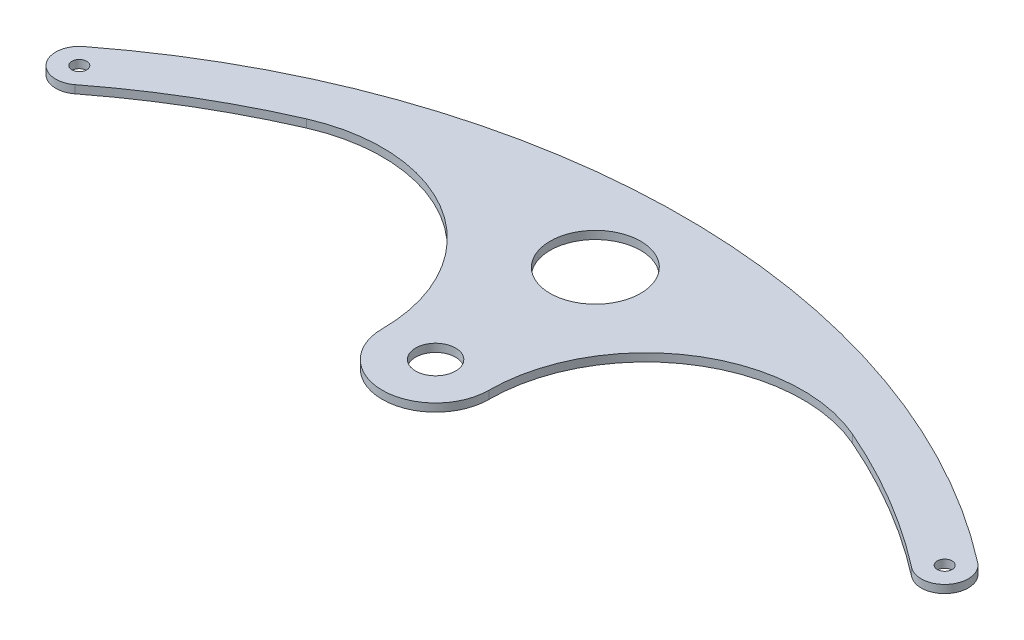
ISO-10303-21;
HEADER;
FILE_DESCRIPTION(('STEP AP214'),'2;1');
FILE_NAME('part.step','',(''),(''),'','','');
FILE_SCHEMA(('AUTOMOTIVE_DESIGN { 1 0 10303 214 1 1 1 1 }'));
ENDSEC;
DATA;
#1=APPLICATION_CONTEXT('core data for automotive mechanical design processes');
#2=APPLICATION_PROTOCOL_DEFINITION('international standard','automotive_design',2000,#1);
#3=PRODUCT_CONTEXT('',#1,'mechanical');
#4=PRODUCT('Part','Part','',(#3));
#5=PRODUCT_RELATED_PRODUCT_CATEGORY('part','',(#4));
#6=PRODUCT_DEFINITION_FORMATION('','',#4);
#7=PRODUCT_DEFINITION_CONTEXT('part definition',#1,'design');
#8=PRODUCT_DEFINITION('design','',#6,#7);
#9=PRODUCT_DEFINITION_SHAPE('','',#8);
#10=(LENGTH_UNIT() NAMED_UNIT(*) SI_UNIT(.MILLI.,.METRE.));
#11=(NAMED_UNIT(*) PLANE_ANGLE_UNIT() SI_UNIT($,.RADIAN.));
#12=(NAMED_UNIT(*) SI_UNIT($,.STERADIAN.) SOLID_ANGLE_UNIT());
#13=UNCERTAINTY_MEASURE_WITH_UNIT(LENGTH_MEASURE(1.E-05),#10,'distance_accuracy_value','');
#14=(GEOMETRIC_REPRESENTATION_CONTEXT(3) GLOBAL_UNCERTAINTY_ASSIGNED_CONTEXT((#13)) GLOBAL_UNIT_ASSIGNED_CONTEXT((#10,
#11,#12)) REPRESENTATION_CONTEXT('',''));
#15=CARTESIAN_POINT('',(0.,0.,0.));
#16=DIRECTION('',(0.,0.,1.));
#17=DIRECTION('',(1.,0.,0.));
#18=AXIS2_PLACEMENT_3D('',#15,#16,#17);
#19=CARTESIAN_POINT('',(51.59375,1.905,66.675));
#20=DIRECTION('',(0.,1.,0.));
#21=DIRECTION('',(0.,0.,1.));
#22=AXIS2_PLACEMENT_3D('',#19,#20,#21);
#23=PLANE('',#22);
#24=CARTESIAN_POINT('',(103.1875,1.905,18.2245));
#25=DIRECTION('',(0.,1.,0.));
#26=DIRECTION('',(0.,0.,1.));
#27=AXIS2_PLACEMENT_3D('',#24,#25,#26);
#28=CIRCLE('',#27,4.7625);
#29=CARTESIAN_POINT('',(103.1875,1.905,13.462));
#30=VERTEX_POINT('',#29);
#31=EDGE_CURVE('E188',#30,#30,#28,.T.);
#32=ORIENTED_EDGE('',*,*,#31,.F.);
#33=EDGE_LOOP('',(#32));
#34=FACE_BOUND('',#33,.T.);
#35=CARTESIAN_POINT('',(0.,1.905,0.));
#36=DIRECTION('',(0.,1.,0.));
#37=DIRECTION('',(0.,0.,1.));
#38=AXIS2_PLACEMENT_3D('',#35,#36,#37);
#39=CIRCLE('',#38,1.778);
#40=CARTESIAN_POINT('',(0.,1.905,-1.778));
#41=VERTEX_POINT('',#40);
#42=EDGE_CURVE('E134',#41,#41,#39,.T.);
#43=ORIENTED_EDGE('',*,*,#42,.F.);
#44=EDGE_LOOP('',(#43));
#45=FACE_BOUND('',#44,.T.);
#46=CARTESIAN_POINT('',(103.1875,1.905,133.35));
#47=DIRECTION('',(0.,-1.,0.));
#48=DIRECTION('',(0.,0.,1.));
#49=AXIS2_PLACEMENT_3D('',#46,#47,#48);
#50=CIRCLE('',#49,162.998792888182);
#51=CARTESIAN_POINT('',(3.43496407253561,1.905,4.43903049373833));
#52=VERTEX_POINT('',#51);
#53=CARTESIAN_POINT('',(38.1113423783337,1.905,-16.0946392220358));
#54=VERTEX_POINT('',#53);
#55=EDGE_CURVE('E145',#52,#54,#50,.T.);
#56=ORIENTED_EDGE('',*,*,#55,.T.);
#57=CARTESIAN_POINT('',(53.0557239572201,1.905,18.2245));
#58=DIRECTION('',(0.,-1.,0.));
#59=DIRECTION('',(0.,0.,1.));
#60=AXIS2_PLACEMENT_3D('',#57,#58,#59);
#61=CIRCLE('',#60,37.4317760427799);
#62=CARTESIAN_POINT('',(90.4875,1.905,18.2245));
#63=VERTEX_POINT('',#62);
#64=EDGE_CURVE('E93',#54,#63,#61,.T.);
#65=ORIENTED_EDGE('',*,*,#64,.T.);
#66=CARTESIAN_POINT('',(103.1875,1.905,18.2245));
#67=DIRECTION('',(0.,1.,0.));
#68=DIRECTION('',(0.,0.,1.));
#69=AXIS2_PLACEMENT_3D('',#66,#67,#68);
#70=CIRCLE('',#69,12.7);
#71=CARTESIAN_POINT('',(115.8875,1.905,18.2245));
#72=VERTEX_POINT('',#71);
#73=EDGE_CURVE('E160',#63,#72,#70,.T.);
#74=ORIENTED_EDGE('',*,*,#73,.T.);
#75=CARTESIAN_POINT('',(153.31927604278,1.905,18.2245));
#76=DIRECTION('',(0.,-1.,0.));
#77=DIRECTION('',(0.,0.,-1.));
#78=AXIS2_PLACEMENT_3D('',#75,#76,#77);
#79=CIRCLE('',#78,37.4317760427799);
#80=CARTESIAN_POINT('',(168.263657621666,1.905,-16.0946392220358));
#81=VERTEX_POINT('',#80);
#82=EDGE_CURVE('E173',#72,#81,#79,.T.);
#83=ORIENTED_EDGE('',*,*,#82,.T.);
#84=CARTESIAN_POINT('',(103.1875,1.905,133.35));
#85=DIRECTION('',(0.,-1.,0.));
#86=DIRECTION('',(0.,0.,1.));
#87=AXIS2_PLACEMENT_3D('',#84,#85,#86);
#88=CIRCLE('',#87,162.998792888182);
#89=CARTESIAN_POINT('',(202.940035927464,1.905,4.43903049373833));
#90=VERTEX_POINT('',#89);
#91=EDGE_CURVE('E112',#81,#90,#88,.T.);
#92=ORIENTED_EDGE('',*,*,#91,.T.);
#93=CARTESIAN_POINT('',(206.375,1.905,0.));
#94=DIRECTION('',(0.,1.,0.));
#95=DIRECTION('',(0.,0.,-1.));
#96=AXIS2_PLACEMENT_3D('',#93,#94,#95);
#97=CIRCLE('',#96,5.6128397361718);
#98=CARTESIAN_POINT('',(209.809964072536,1.905,-4.43903049373834));
#99=VERTEX_POINT('',#98);
#100=EDGE_CURVE('E106',#90,#99,#97,.T.);
#101=ORIENTED_EDGE('',*,*,#100,.T.);
#102=CARTESIAN_POINT('',(103.1875,1.905,133.35));
#103=DIRECTION('',(0.,1.,0.));
#104=DIRECTION('',(0.,0.,1.));
#105=AXIS2_PLACEMENT_3D('',#102,#103,#104);
#106=CIRCLE('',#105,174.224472360525);
#107=CARTESIAN_POINT('',(-3.43496407253561,1.905,-4.43903049373833));
#108=VERTEX_POINT('',#107);
#109=EDGE_CURVE('E110',#99,#108,#106,.T.);
#110=ORIENTED_EDGE('',*,*,#109,.T.);
#111=CARTESIAN_POINT('',(0.,1.905,0.));
#112=DIRECTION('',(0.,1.,0.));
#113=DIRECTION('',(0.,0.,1.));
#114=AXIS2_PLACEMENT_3D('',#111,#112,#113);
#115=CIRCLE('',#114,5.61283973617181);
#116=EDGE_CURVE('E50',#108,#52,#115,.T.);
#117=ORIENTED_EDGE('',*,*,#116,.T.);
#118=EDGE_LOOP('',(#56,#65,#74,#83,#92,#101,#110,#117));
#119=FACE_BOUND('',#118,.T.);
#120=CARTESIAN_POINT('',(206.375,1.905,0.));
#121=DIRECTION('',(0.,1.,0.));
#122=DIRECTION('',(0.,0.,1.));
#123=AXIS2_PLACEMENT_3D('',#120,#121,#122);
#124=CIRCLE('',#123,1.77800000000001);
#125=CARTESIAN_POINT('',(206.375,1.905,-1.77800000000001));
#126=VERTEX_POINT('',#125);
#127=EDGE_CURVE('E182',#126,#126,#124,.T.);
#128=ORIENTED_EDGE('',*,*,#127,.F.);
#129=EDGE_LOOP('',(#128));
#130=FACE_BOUND('',#129,.T.);
#131=CARTESIAN_POINT('',(103.1875,1.905,-19.8755));
#132=DIRECTION('',(0.,1.,0.));
#133=DIRECTION('',(0.,0.,1.));
#134=AXIS2_PLACEMENT_3D('',#131,#132,#133);
#135=CIRCLE('',#134,10.795);
#136=CARTESIAN_POINT('',(103.1875,1.905,-30.6705));
#137=VERTEX_POINT('',#136);
#138=EDGE_CURVE('E194',#137,#137,#135,.T.);
#139=ORIENTED_EDGE('',*,*,#138,.F.);
#140=EDGE_LOOP('',(#139));
#141=FACE_BOUND('',#140,.T.);
#142=ADVANCED_FACE('F33',(#34,#45,#119,#130,#141),#23,.T.);
#143=CARTESIAN_POINT('',(51.59375,0.,66.675));
#144=DIRECTION('',(0.,1.,0.));
#145=DIRECTION('',(0.,0.,1.));
#146=AXIS2_PLACEMENT_3D('',#143,#144,#145);
#147=PLANE('',#146);
#148=CARTESIAN_POINT('',(103.1875,0.,133.35));
#149=DIRECTION('',(0.,-1.,0.));
#150=DIRECTION('',(0.,0.,1.));
#151=AXIS2_PLACEMENT_3D('',#148,#149,#150);
#152=CIRCLE('',#151,162.998792888182);
#153=CARTESIAN_POINT('',(3.43496407253561,0.,4.43903049373833));
#154=VERTEX_POINT('',#153);
#155=CARTESIAN_POINT('',(38.1113423783337,0.,-16.0946392220358));
#156=VERTEX_POINT('',#155);
#157=EDGE_CURVE('E130',#154,#156,#152,.T.);
#158=ORIENTED_EDGE('',*,*,#157,.F.);
#159=CARTESIAN_POINT('',(0.,0.,0.));
#160=DIRECTION('',(0.,1.,0.));
#161=DIRECTION('',(0.,0.,1.));
#162=AXIS2_PLACEMENT_3D('',#159,#160,#161);
#163=CIRCLE('',#162,5.61283973617181);
#164=CARTESIAN_POINT('',(-3.43496407253561,0.,-4.43903049373833));
#165=VERTEX_POINT('',#164);
#166=EDGE_CURVE('E85',#165,#154,#163,.T.);
#167=ORIENTED_EDGE('',*,*,#166,.F.);
#168=CARTESIAN_POINT('',(103.1875,0.,133.35));
#169=DIRECTION('',(0.,1.,0.));
#170=DIRECTION('',(0.,0.,1.));
#171=AXIS2_PLACEMENT_3D('',#168,#169,#170);
#172=CIRCLE('',#171,174.224472360525);
#173=CARTESIAN_POINT('',(209.809964072536,0.,-4.43903049373834));
#174=VERTEX_POINT('',#173);
#175=EDGE_CURVE('E79',#174,#165,#172,.T.);
#176=ORIENTED_EDGE('',*,*,#175,.F.);
#177=CARTESIAN_POINT('',(206.375,0.,0.));
#178=DIRECTION('',(0.,1.,0.));
#179=DIRECTION('',(0.,0.,-1.));
#180=AXIS2_PLACEMENT_3D('',#177,#178,#179);
#181=CIRCLE('',#180,5.6128397361718);
#182=CARTESIAN_POINT('',(202.940035927464,0.,4.43903049373833));
#183=VERTEX_POINT('',#182);
#184=EDGE_CURVE('E120',#183,#174,#181,.T.);
#185=ORIENTED_EDGE('',*,*,#184,.F.);
#186=CARTESIAN_POINT('',(103.1875,0.,133.35));
#187=DIRECTION('',(0.,-1.,0.));
#188=DIRECTION('',(0.,0.,1.));
#189=AXIS2_PLACEMENT_3D('',#186,#187,#188);
#190=CIRCLE('',#189,162.998792888182);
#191=CARTESIAN_POINT('',(168.263657621666,0.,-16.0946392220358));
#192=VERTEX_POINT('',#191);
#193=EDGE_CURVE('E140',#192,#183,#190,.T.);
#194=ORIENTED_EDGE('',*,*,#193,.F.);
#195=CARTESIAN_POINT('',(153.31927604278,0.,18.2245));
#196=DIRECTION('',(0.,-1.,0.));
#197=DIRECTION('',(0.,0.,-1.));
#198=AXIS2_PLACEMENT_3D('',#195,#196,#197);
#199=CIRCLE('',#198,37.4317760427799);
#200=CARTESIAN_POINT('',(115.8875,0.,18.2245));
#201=VERTEX_POINT('',#200);
#202=EDGE_CURVE('E138',#201,#192,#199,.T.);
#203=ORIENTED_EDGE('',*,*,#202,.F.);
#204=CARTESIAN_POINT('',(103.1875,0.,18.2245));
#205=DIRECTION('',(0.,1.,0.));
#206=DIRECTION('',(0.,0.,1.));
#207=AXIS2_PLACEMENT_3D('',#204,#205,#206);
#208=CIRCLE('',#207,12.7);
#209=CARTESIAN_POINT('',(90.4875,0.,18.2245));
#210=VERTEX_POINT('',#209);
#211=EDGE_CURVE('E136',#210,#201,#208,.T.);
#212=ORIENTED_EDGE('',*,*,#211,.F.);
#213=CARTESIAN_POINT('',(53.0557239572201,0.,18.2245));
#214=DIRECTION('',(0.,-1.,0.));
#215=DIRECTION('',(0.,0.,1.));
#216=AXIS2_PLACEMENT_3D('',#213,#214,#215);
#217=CIRCLE('',#216,37.4317760427799);
#218=EDGE_CURVE('E133',#156,#210,#217,.T.);
#219=ORIENTED_EDGE('',*,*,#218,.F.);
#220=EDGE_LOOP('',(#158,#167,#176,#185,#194,#203,#212,#219));
#221=FACE_BOUND('',#220,.T.);
#222=CARTESIAN_POINT('',(0.,0.,0.));
#223=DIRECTION('',(0.,1.,0.));
#224=DIRECTION('',(0.,0.,1.));
#225=AXIS2_PLACEMENT_3D('',#222,#223,#224);
#226=CIRCLE('',#225,1.778);
#227=CARTESIAN_POINT('',(0.,0.,-1.778));
#228=VERTEX_POINT('',#227);
#229=EDGE_CURVE('E179',#228,#228,#226,.T.);
#230=ORIENTED_EDGE('',*,*,#229,.T.);
#231=EDGE_LOOP('',(#230));
#232=FACE_BOUND('',#231,.T.);
#233=CARTESIAN_POINT('',(206.375,0.,0.));
#234=DIRECTION('',(0.,1.,0.));
#235=DIRECTION('',(0.,0.,1.));
#236=AXIS2_PLACEMENT_3D('',#233,#234,#235);
#237=CIRCLE('',#236,1.77800000000001);
#238=CARTESIAN_POINT('',(206.375,0.,-1.77800000000001));
#239=VERTEX_POINT('',#238);
#240=EDGE_CURVE('E185',#239,#239,#237,.T.);
#241=ORIENTED_EDGE('',*,*,#240,.T.);
#242=EDGE_LOOP('',(#241));
#243=FACE_BOUND('',#242,.T.);
#244=CARTESIAN_POINT('',(103.1875,0.,18.2245));
#245=DIRECTION('',(0.,1.,0.));
#246=DIRECTION('',(0.,0.,1.));
#247=AXIS2_PLACEMENT_3D('',#244,#245,#246);
#248=CIRCLE('',#247,4.7625);
#249=CARTESIAN_POINT('',(103.1875,0.,13.462));
#250=VERTEX_POINT('',#249);
#251=EDGE_CURVE('E191',#250,#250,#248,.T.);
#252=ORIENTED_EDGE('',*,*,#251,.T.);
#253=EDGE_LOOP('',(#252));
#254=FACE_BOUND('',#253,.T.);
#255=CARTESIAN_POINT('',(103.1875,0.,-19.8755));
#256=DIRECTION('',(0.,1.,0.));
#257=DIRECTION('',(0.,0.,1.));
#258=AXIS2_PLACEMENT_3D('',#255,#256,#257);
#259=CIRCLE('',#258,10.795);
#260=CARTESIAN_POINT('',(103.1875,0.,-30.6705));
#261=VERTEX_POINT('',#260);
#262=EDGE_CURVE('E197',#261,#261,#259,.T.);
#263=ORIENTED_EDGE('',*,*,#262,.T.);
#264=EDGE_LOOP('',(#263));
#265=FACE_BOUND('',#264,.T.);
#266=ADVANCED_FACE('F164',(#221,#232,#243,#254,#265),#147,.F.);
#267=CARTESIAN_POINT('',(103.1875,1.905,133.35));
#268=DIRECTION('',(0.,-1.,0.));
#269=DIRECTION('',(0.,0.,-1.));
#270=AXIS2_PLACEMENT_3D('',#267,#268,#269);
#271=CYLINDRICAL_SURFACE('',#270,162.998792888182);
#272=ORIENTED_EDGE('',*,*,#157,.T.);
#273=DIRECTION('',(0.,-1.,0.));
#274=VECTOR('',#273,1.);
#275=CARTESIAN_POINT('',(38.1113423783337,1.905,-16.0946392220358));
#276=LINE('',#275,#274);
#277=EDGE_CURVE('E11',#54,#156,#276,.T.);
#278=ORIENTED_EDGE('',*,*,#277,.F.);
#279=ORIENTED_EDGE('',*,*,#55,.F.);
#280=DIRECTION('',(0.,-1.,0.));
#281=VECTOR('',#280,1.);
#282=CARTESIAN_POINT('',(3.43496407253561,1.905,4.43903049373833));
#283=LINE('',#282,#281);
#284=EDGE_CURVE('E126',#52,#154,#283,.T.);
#285=ORIENTED_EDGE('',*,*,#284,.T.);
#286=EDGE_LOOP('',(#272,#278,#279,#285));
#287=FACE_BOUND('',#286,.T.);
#288=ADVANCED_FACE('F35',(#287),#271,.F.);
#289=CARTESIAN_POINT('',(53.0557239572201,1.905,18.2245));
#290=DIRECTION('',(0.,-1.,0.));
#291=DIRECTION('',(0.,0.,-1.));
#292=AXIS2_PLACEMENT_3D('',#289,#290,#291);
#293=CYLINDRICAL_SURFACE('',#292,37.4317760427799);
#294=ORIENTED_EDGE('',*,*,#218,.T.);
#295=DIRECTION('',(0.,-1.,0.));
#296=VECTOR('',#295,1.);
#297=CARTESIAN_POINT('',(90.4875,1.905,18.2245));
#298=LINE('',#297,#296);
#299=EDGE_CURVE('E42',#63,#210,#298,.T.);
#300=ORIENTED_EDGE('',*,*,#299,.F.);
#301=ORIENTED_EDGE('',*,*,#64,.F.);
#302=ORIENTED_EDGE('',*,*,#277,.T.);
#303=EDGE_LOOP('',(#294,#300,#301,#302));
#304=FACE_BOUND('',#303,.T.);
#305=ADVANCED_FACE('F231',(#304),#293,.F.);
#306=CARTESIAN_POINT('',(103.1875,1.905,18.2245));
#307=DIRECTION('',(0.,-1.,0.));
#308=DIRECTION('',(0.,0.,-1.));
#309=AXIS2_PLACEMENT_3D('',#306,#307,#308);
#310=CYLINDRICAL_SURFACE('',#309,12.7);
#311=ORIENTED_EDGE('',*,*,#211,.T.);
#312=DIRECTION('',(0.,-1.,0.));
#313=VECTOR('',#312,1.);
#314=CARTESIAN_POINT('',(115.8875,1.905,18.2245));
#315=LINE('',#314,#313);
#316=EDGE_CURVE('E152',#72,#201,#315,.T.);
#317=ORIENTED_EDGE('',*,*,#316,.F.);
#318=ORIENTED_EDGE('',*,*,#73,.F.);
#319=ORIENTED_EDGE('',*,*,#299,.T.);
#320=EDGE_LOOP('',(#311,#317,#318,#319));
#321=FACE_BOUND('',#320,.T.);
#322=ADVANCED_FACE('F158',(#321),#310,.T.);
#323=CARTESIAN_POINT('',(153.31927604278,1.905,18.2245));
#324=DIRECTION('',(0.,-1.,0.));
#325=DIRECTION('',(0.,0.,-1.));
#326=AXIS2_PLACEMENT_3D('',#323,#324,#325);
#327=CYLINDRICAL_SURFACE('',#326,37.4317760427799);
#328=ORIENTED_EDGE('',*,*,#202,.T.);
#329=DIRECTION('',(0.,-1.,0.));
#330=VECTOR('',#329,1.);
#331=CARTESIAN_POINT('',(168.263657621666,1.905,-16.0946392220358));
#332=LINE('',#331,#330);
#333=EDGE_CURVE('E149',#81,#192,#332,.T.);
#334=ORIENTED_EDGE('',*,*,#333,.F.);
#335=ORIENTED_EDGE('',*,*,#82,.F.);
#336=ORIENTED_EDGE('',*,*,#316,.T.);
#337=EDGE_LOOP('',(#328,#334,#335,#336));
#338=FACE_BOUND('',#337,.T.);
#339=ADVANCED_FACE('F169',(#338),#327,.F.);
#340=CARTESIAN_POINT('',(103.1875,1.905,133.35));
#341=DIRECTION('',(0.,-1.,0.));
#342=DIRECTION('',(0.,0.,-1.));
#343=AXIS2_PLACEMENT_3D('',#340,#341,#342);
#344=CYLINDRICAL_SURFACE('',#343,162.998792888182);
#345=ORIENTED_EDGE('',*,*,#193,.T.);
#346=DIRECTION('',(0.,-1.,0.));
#347=VECTOR('',#346,1.);
#348=CARTESIAN_POINT('',(202.940035927464,1.905,4.43903049373833));
#349=LINE('',#348,#347);
#350=EDGE_CURVE('E121',#90,#183,#349,.T.);
#351=ORIENTED_EDGE('',*,*,#350,.F.);
#352=ORIENTED_EDGE('',*,*,#91,.F.);
#353=ORIENTED_EDGE('',*,*,#333,.T.);
#354=EDGE_LOOP('',(#345,#351,#352,#353));
#355=FACE_BOUND('',#354,.T.);
#356=ADVANCED_FACE('F172',(#355),#344,.F.);
#357=CARTESIAN_POINT('',(206.375,1.905,0.));
#358=DIRECTION('',(0.,-1.,0.));
#359=DIRECTION('',(0.,0.,-1.));
#360=AXIS2_PLACEMENT_3D('',#357,#358,#359);
#361=CYLINDRICAL_SURFACE('',#360,5.6128397361718);
#362=ORIENTED_EDGE('',*,*,#184,.T.);
#363=DIRECTION('',(0.,-1.,0.));
#364=VECTOR('',#363,1.);
#365=CARTESIAN_POINT('',(209.809964072536,1.905,-4.43903049373834));
#366=LINE('',#365,#364);
#367=EDGE_CURVE('E117',#99,#174,#366,.T.);
#368=ORIENTED_EDGE('',*,*,#367,.F.);
#369=ORIENTED_EDGE('',*,*,#100,.F.);
#370=ORIENTED_EDGE('',*,*,#350,.T.);
#371=EDGE_LOOP('',(#362,#368,#369,#370));
#372=FACE_BOUND('',#371,.T.);
#373=ADVANCED_FACE('F118',(#372),#361,.T.);
#374=CARTESIAN_POINT('',(103.1875,1.905,133.35));
#375=DIRECTION('',(0.,-1.,0.));
#376=DIRECTION('',(0.,0.,-1.));
#377=AXIS2_PLACEMENT_3D('',#374,#375,#376);
#378=CYLINDRICAL_SURFACE('',#377,174.224472360525);
#379=ORIENTED_EDGE('',*,*,#175,.T.);
#380=DIRECTION('',(0.,-1.,0.));
#381=VECTOR('',#380,1.);
#382=CARTESIAN_POINT('',(-3.43496407253561,1.905,-4.43903049373833));
#383=LINE('',#382,#381);
#384=EDGE_CURVE('E122',#108,#165,#383,.T.);
#385=ORIENTED_EDGE('',*,*,#384,.F.);
#386=ORIENTED_EDGE('',*,*,#109,.F.);
#387=ORIENTED_EDGE('',*,*,#367,.T.);
#388=EDGE_LOOP('',(#379,#385,#386,#387));
#389=FACE_BOUND('',#388,.T.);
#390=ADVANCED_FACE('F124',(#389),#378,.T.);
#391=CARTESIAN_POINT('',(0.,1.905,0.));
#392=DIRECTION('',(0.,-1.,0.));
#393=DIRECTION('',(0.,0.,-1.));
#394=AXIS2_PLACEMENT_3D('',#391,#392,#393);
#395=CYLINDRICAL_SURFACE('',#394,5.61283973617181);
#396=ORIENTED_EDGE('',*,*,#166,.T.);
#397=ORIENTED_EDGE('',*,*,#284,.F.);
#398=ORIENTED_EDGE('',*,*,#116,.F.);
#399=ORIENTED_EDGE('',*,*,#384,.T.);
#400=EDGE_LOOP('',(#396,#397,#398,#399));
#401=FACE_BOUND('',#400,.T.);
#402=ADVANCED_FACE('F219',(#401),#395,.T.);
#403=CARTESIAN_POINT('',(0.,1.905,0.));
#404=DIRECTION('',(0.,-1.,0.));
#405=DIRECTION('',(0.,0.,-1.));
#406=AXIS2_PLACEMENT_3D('',#403,#404,#405);
#407=CYLINDRICAL_SURFACE('',#406,1.778);
#408=CARTESIAN_POINT('',(0.,1.905,-1.778));
#409=CARTESIAN_POINT('',(0.,1.88515625,-1.778));
#410=CARTESIAN_POINT('',(0.,1.8653125,-1.778));
#411=CARTESIAN_POINT('',(0.,1.825625,-1.778));
#412=CARTESIAN_POINT('',(0.,1.80578125,-1.778));
#413=CARTESIAN_POINT('',(0.,1.76609375,-1.778));
#414=CARTESIAN_POINT('',(0.,1.74625,-1.778));
#415=CARTESIAN_POINT('',(0.,1.7065625,-1.778));
#416=CARTESIAN_POINT('',(0.,1.68671875,-1.778));
#417=CARTESIAN_POINT('',(0.,1.64703125,-1.778));
#418=CARTESIAN_POINT('',(0.,1.6271875,-1.778));
#419=CARTESIAN_POINT('',(0.,1.5875,-1.778));
#420=CARTESIAN_POINT('',(0.,1.56765625,-1.778));
#421=CARTESIAN_POINT('',(0.,1.52796875,-1.778));
#422=CARTESIAN_POINT('',(0.,1.508125,-1.778));
#423=CARTESIAN_POINT('',(0.,1.4684375,-1.778));
#424=CARTESIAN_POINT('',(0.,1.44859375,-1.778));
#425=CARTESIAN_POINT('',(0.,1.40890625,-1.778));
#426=CARTESIAN_POINT('',(0.,1.3890625,-1.778));
#427=CARTESIAN_POINT('',(0.,1.349375,-1.778));
#428=CARTESIAN_POINT('',(0.,1.32953125,-1.778));
#429=CARTESIAN_POINT('',(0.,1.28984375,-1.778));
#430=CARTESIAN_POINT('',(0.,1.27,-1.778));
#431=CARTESIAN_POINT('',(0.,1.2303125,-1.778));
#432=CARTESIAN_POINT('',(0.,1.21046875,-1.778));
#433=CARTESIAN_POINT('',(0.,1.17078125,-1.778));
#434=CARTESIAN_POINT('',(0.,1.1509375,-1.778));
#435=CARTESIAN_POINT('',(0.,1.11125,-1.778));
#436=CARTESIAN_POINT('',(0.,1.09140625,-1.778));
#437=CARTESIAN_POINT('',(0.,1.05171875,-1.778));
#438=CARTESIAN_POINT('',(0.,1.031875,-1.778));
#439=CARTESIAN_POINT('',(0.,0.9921875,-1.778));
#440=CARTESIAN_POINT('',(0.,0.97234375,-1.778));
#441=CARTESIAN_POINT('',(0.,0.93265625,-1.778));
#442=CARTESIAN_POINT('',(0.,0.9128125,-1.778));
#443=CARTESIAN_POINT('',(0.,0.873125,-1.778));
#444=CARTESIAN_POINT('',(0.,0.85328125,-1.778));
#445=CARTESIAN_POINT('',(0.,0.81359375,-1.778));
#446=CARTESIAN_POINT('',(0.,0.79375,-1.778));
#447=CARTESIAN_POINT('',(0.,0.7540625,-1.778));
#448=CARTESIAN_POINT('',(0.,0.73421875,-1.778));
#449=CARTESIAN_POINT('',(0.,0.69453125,-1.778));
#450=CARTESIAN_POINT('',(0.,0.6746875,-1.778));
#451=CARTESIAN_POINT('',(0.,0.635,-1.778));
#452=CARTESIAN_POINT('',(0.,0.61515625,-1.778));
#453=CARTESIAN_POINT('',(0.,0.57546875,-1.778));
#454=CARTESIAN_POINT('',(0.,0.555625,-1.778));
#455=CARTESIAN_POINT('',(0.,0.5159375,-1.778));
#456=CARTESIAN_POINT('',(0.,0.49609375,-1.778));
#457=CARTESIAN_POINT('',(0.,0.45640625,-1.778));
#458=CARTESIAN_POINT('',(0.,0.4365625,-1.778));
#459=CARTESIAN_POINT('',(0.,0.396875,-1.778));
#460=CARTESIAN_POINT('',(0.,0.37703125,-1.778));
#461=CARTESIAN_POINT('',(0.,0.33734375,-1.778));
#462=CARTESIAN_POINT('',(0.,0.3175,-1.778));
#463=CARTESIAN_POINT('',(0.,0.2778125,-1.778));
#464=CARTESIAN_POINT('',(0.,0.25796875,-1.778));
#465=CARTESIAN_POINT('',(0.,0.21828125,-1.778));
#466=CARTESIAN_POINT('',(0.,0.1984375,-1.778));
#467=CARTESIAN_POINT('',(0.,0.15875,-1.778));
#468=CARTESIAN_POINT('',(0.,0.13890625,-1.778));
#469=CARTESIAN_POINT('',(0.,0.09921875,-1.778));
#470=CARTESIAN_POINT('',(0.,0.0793749999999999,-1.778));
#471=CARTESIAN_POINT('',(0.,0.0396874999999999,-1.778));
#472=CARTESIAN_POINT('',(0.,0.01984375,-1.778));
#473=CARTESIAN_POINT('',(0.,0.,-1.778));
#474=B_SPLINE_CURVE_WITH_KNOTS('',3,(#408,#409,#410,#411,#412,#413,#414,#415,#416,#417,#418,
#419,#420,#421,#422,#423,#424,#425,#426,#427,#428,#429,#430,#431,#432,#433,#434,#435,#436,#437,
#438,#439,#440,#441,#442,#443,#444,#445,#446,#447,#448,#449,#450,#451,#452,#453,#454,#455,#456,
#457,#458,#459,#460,#461,#462,#463,#464,#465,#466,#467,#468,#469,#470,#471,#472,#473),
.UNSPECIFIED.,.F.,.F.,(4,2,2,2,2,2,2,2,2,2,2,2,2,2,2,2,2,2,2,2,2,2,2,2,2,2,2,2,2,2,2,2,4),(0.,
0.0595312499999999,0.1190625,0.17859375,0.238125,0.29765625,0.3571875,0.41671875,0.47625,
0.53578125,0.5953125,0.65484375,0.714375,0.77390625,0.833437499999999,0.89296875,0.9525,
1.01203125,1.0715625,1.13109375,1.190625,1.25015625,1.3096875,1.36921875,1.42875,1.48828125,
1.5478125,1.60734375,1.666875,1.72640625,1.7859375,1.84546875,1.905),.UNSPECIFIED.);
#475=EDGE_CURVE('BSEAM216',#41,#228,#474,.T.);
#476=ORIENTED_EDGE('',*,*,#42,.T.);
#477=ORIENTED_EDGE('',*,*,#229,.F.);
#478=ORIENTED_EDGE('',*,*,#475,.T.);
#479=ORIENTED_EDGE('',*,*,#475,.F.);
#480=EDGE_LOOP('',(#476,#478,#477,#479));
#481=FACE_BOUND('',#480,.T.);
#482=ADVANCED_FACE('F216',(#481),#407,.F.);
#483=CARTESIAN_POINT('',(206.375,1.905,0.));
#484=DIRECTION('',(0.,-1.,0.));
#485=DIRECTION('',(0.,0.,-1.));
#486=AXIS2_PLACEMENT_3D('',#483,#484,#485);
#487=CYLINDRICAL_SURFACE('',#486,1.77800000000001);
#488=CARTESIAN_POINT('',(206.375,1.905,-1.77800000000001));
#489=CARTESIAN_POINT('',(206.375,1.88515625,-1.77800000000001));
#490=CARTESIAN_POINT('',(206.375,1.8653125,-1.77800000000001));
#491=CARTESIAN_POINT('',(206.375,1.825625,-1.77800000000001));
#492=CARTESIAN_POINT('',(206.375,1.80578125,-1.77800000000001));
#493=CARTESIAN_POINT('',(206.375,1.76609375,-1.77800000000001));
#494=CARTESIAN_POINT('',(206.375,1.74625,-1.77800000000001));
#495=CARTESIAN_POINT('',(206.375,1.7065625,-1.77800000000001));
#496=CARTESIAN_POINT('',(206.375,1.68671875,-1.77800000000001));
#497=CARTESIAN_POINT('',(206.375,1.64703125,-1.77800000000001));
#498=CARTESIAN_POINT('',(206.375,1.6271875,-1.77800000000001));
#499=CARTESIAN_POINT('',(206.375,1.5875,-1.77800000000001));
#500=CARTESIAN_POINT('',(206.375,1.56765625,-1.77800000000001));
#501=CARTESIAN_POINT('',(206.375,1.52796875,-1.77800000000001));
#502=CARTESIAN_POINT('',(206.375,1.508125,-1.77800000000001));
#503=CARTESIAN_POINT('',(206.375,1.4684375,-1.77800000000001));
#504=CARTESIAN_POINT('',(206.375,1.44859375,-1.77800000000001));
#505=CARTESIAN_POINT('',(206.375,1.40890625,-1.77800000000001));
#506=CARTESIAN_POINT('',(206.375,1.3890625,-1.77800000000001));
#507=CARTESIAN_POINT('',(206.375,1.349375,-1.77800000000001));
#508=CARTESIAN_POINT('',(206.375,1.32953125,-1.77800000000001));
#509=CARTESIAN_POINT('',(206.375,1.28984375,-1.77800000000001));
#510=CARTESIAN_POINT('',(206.375,1.27,-1.77800000000001));
#511=CARTESIAN_POINT('',(206.375,1.2303125,-1.77800000000001));
#512=CARTESIAN_POINT('',(206.375,1.21046875,-1.77800000000001));
#513=CARTESIAN_POINT('',(206.375,1.17078125,-1.77800000000001));
#514=CARTESIAN_POINT('',(206.375,1.1509375,-1.77800000000001));
#515=CARTESIAN_POINT('',(206.375,1.11125,-1.77800000000001));
#516=CARTESIAN_POINT('',(206.375,1.09140625,-1.77800000000001));
#517=CARTESIAN_POINT('',(206.375,1.05171875,-1.77800000000001));
#518=CARTESIAN_POINT('',(206.375,1.031875,-1.77800000000001));
#519=CARTESIAN_POINT('',(206.375,0.9921875,-1.77800000000001));
#520=CARTESIAN_POINT('',(206.375,0.97234375,-1.77800000000001));
#521=CARTESIAN_POINT('',(206.375,0.93265625,-1.77800000000001));
#522=CARTESIAN_POINT('',(206.375,0.9128125,-1.77800000000001));
#523=CARTESIAN_POINT('',(206.375,0.873125,-1.77800000000001));
#524=CARTESIAN_POINT('',(206.375,0.85328125,-1.77800000000001));
#525=CARTESIAN_POINT('',(206.375,0.81359375,-1.77800000000001));
#526=CARTESIAN_POINT('',(206.375,0.79375,-1.77800000000001));
#527=CARTESIAN_POINT('',(206.375,0.7540625,-1.77800000000001));
#528=CARTESIAN_POINT('',(206.375,0.73421875,-1.77800000000001));
#529=CARTESIAN_POINT('',(206.375,0.69453125,-1.77800000000001));
#530=CARTESIAN_POINT('',(206.375,0.6746875,-1.77800000000001));
#531=CARTESIAN_POINT('',(206.375,0.635,-1.77800000000001));
#532=CARTESIAN_POINT('',(206.375,0.61515625,-1.77800000000001));
#533=CARTESIAN_POINT('',(206.375,0.57546875,-1.77800000000001));
#534=CARTESIAN_POINT('',(206.375,0.555625,-1.77800000000001));
#535=CARTESIAN_POINT('',(206.375,0.5159375,-1.77800000000001));
#536=CARTESIAN_POINT('',(206.375,0.49609375,-1.77800000000001));
#537=CARTESIAN_POINT('',(206.375,0.45640625,-1.77800000000001));
#538=CARTESIAN_POINT('',(206.375,0.4365625,-1.77800000000001));
#539=CARTESIAN_POINT('',(206.375,0.396875,-1.77800000000001));
#540=CARTESIAN_POINT('',(206.375,0.37703125,-1.77800000000001));
#541=CARTESIAN_POINT('',(206.375,0.33734375,-1.77800000000001));
#542=CARTESIAN_POINT('',(206.375,0.3175,-1.77800000000001));
#543=CARTESIAN_POINT('',(206.375,0.2778125,-1.77800000000001));
#544=CARTESIAN_POINT('',(206.375,0.25796875,-1.77800000000001));
#545=CARTESIAN_POINT('',(206.375,0.21828125,-1.77800000000001));
#546=CARTESIAN_POINT('',(206.375,0.1984375,-1.77800000000001));
#547=CARTESIAN_POINT('',(206.375,0.15875,-1.77800000000001));
#548=CARTESIAN_POINT('',(206.375,0.13890625,-1.77800000000001));
#549=CARTESIAN_POINT('',(206.375,0.09921875,-1.77800000000001));
#550=CARTESIAN_POINT('',(206.375,0.0793749999999999,-1.77800000000001));
#551=CARTESIAN_POINT('',(206.375,0.0396874999999999,-1.77800000000001));
#552=CARTESIAN_POINT('',(206.375,0.01984375,-1.77800000000001));
#553=CARTESIAN_POINT('',(206.375,0.,-1.77800000000001));
#554=B_SPLINE_CURVE_WITH_KNOTS('',3,(#488,#489,#490,#491,#492,#493,#494,#495,#496,#497,#498,
#499,#500,#501,#502,#503,#504,#505,#506,#507,#508,#509,#510,#511,#512,#513,#514,#515,#516,#517,
#518,#519,#520,#521,#522,#523,#524,#525,#526,#527,#528,#529,#530,#531,#532,#533,#534,#535,#536,
#537,#538,#539,#540,#541,#542,#543,#544,#545,#546,#547,#548,#549,#550,#551,#552,#553),
.UNSPECIFIED.,.F.,.F.,(4,2,2,2,2,2,2,2,2,2,2,2,2,2,2,2,2,2,2,2,2,2,2,2,2,2,2,2,2,2,2,2,4),(0.,
0.0595312499999999,0.1190625,0.17859375,0.238125,0.29765625,0.3571875,0.41671875,0.47625,
0.53578125,0.5953125,0.65484375,0.714375,0.77390625,0.833437499999999,0.89296875,0.9525,
1.01203125,1.0715625,1.13109375,1.190625,1.25015625,1.3096875,1.36921875,1.42875,1.48828125,
1.5478125,1.60734375,1.666875,1.72640625,1.7859375,1.84546875,1.905),.UNSPECIFIED.);
#555=EDGE_CURVE('BSEAM295',#126,#239,#554,.T.);
#556=ORIENTED_EDGE('',*,*,#127,.T.);
#557=ORIENTED_EDGE('',*,*,#240,.F.);
#558=ORIENTED_EDGE('',*,*,#555,.T.);
#559=ORIENTED_EDGE('',*,*,#555,.F.);
#560=EDGE_LOOP('',(#556,#558,#557,#559));
#561=FACE_BOUND('',#560,.T.);
#562=ADVANCED_FACE('F295',(#561),#487,.F.);
#563=CARTESIAN_POINT('',(103.1875,1.905,18.2245));
#564=DIRECTION('',(0.,-1.,0.));
#565=DIRECTION('',(0.,0.,-1.));
#566=AXIS2_PLACEMENT_3D('',#563,#564,#565);
#567=CYLINDRICAL_SURFACE('',#566,4.7625);
#568=CARTESIAN_POINT('',(103.1875,1.905,13.462));
#569=CARTESIAN_POINT('',(103.1875,1.88515625,13.462));
#570=CARTESIAN_POINT('',(103.1875,1.8653125,13.462));
#571=CARTESIAN_POINT('',(103.1875,1.825625,13.462));
#572=CARTESIAN_POINT('',(103.1875,1.80578125,13.462));
#573=CARTESIAN_POINT('',(103.1875,1.76609375,13.462));
#574=CARTESIAN_POINT('',(103.1875,1.74625,13.462));
#575=CARTESIAN_POINT('',(103.1875,1.7065625,13.462));
#576=CARTESIAN_POINT('',(103.1875,1.68671875,13.462));
#577=CARTESIAN_POINT('',(103.1875,1.64703125,13.462));
#578=CARTESIAN_POINT('',(103.1875,1.6271875,13.462));
#579=CARTESIAN_POINT('',(103.1875,1.5875,13.462));
#580=CARTESIAN_POINT('',(103.1875,1.56765625,13.462));
#581=CARTESIAN_POINT('',(103.1875,1.52796875,13.462));
#582=CARTESIAN_POINT('',(103.1875,1.508125,13.462));
#583=CARTESIAN_POINT('',(103.1875,1.4684375,13.462));
#584=CARTESIAN_POINT('',(103.1875,1.44859375,13.462));
#585=CARTESIAN_POINT('',(103.1875,1.40890625,13.462));
#586=CARTESIAN_POINT('',(103.1875,1.3890625,13.462));
#587=CARTESIAN_POINT('',(103.1875,1.349375,13.462));
#588=CARTESIAN_POINT('',(103.1875,1.32953125,13.462));
#589=CARTESIAN_POINT('',(103.1875,1.28984375,13.462));
#590=CARTESIAN_POINT('',(103.1875,1.27,13.462));
#591=CARTESIAN_POINT('',(103.1875,1.2303125,13.462));
#592=CARTESIAN_POINT('',(103.1875,1.21046875,13.462));
#593=CARTESIAN_POINT('',(103.1875,1.17078125,13.462));
#594=CARTESIAN_POINT('',(103.1875,1.1509375,13.462));
#595=CARTESIAN_POINT('',(103.1875,1.11125,13.462));
#596=CARTESIAN_POINT('',(103.1875,1.09140625,13.462));
#597=CARTESIAN_POINT('',(103.1875,1.05171875,13.462));
#598=CARTESIAN_POINT('',(103.1875,1.031875,13.462));
#599=CARTESIAN_POINT('',(103.1875,0.9921875,13.462));
#600=CARTESIAN_POINT('',(103.1875,0.97234375,13.462));
#601=CARTESIAN_POINT('',(103.1875,0.93265625,13.462));
#602=CARTESIAN_POINT('',(103.1875,0.9128125,13.462));
#603=CARTESIAN_POINT('',(103.1875,0.873125,13.462));
#604=CARTESIAN_POINT('',(103.1875,0.85328125,13.462));
#605=CARTESIAN_POINT('',(103.1875,0.81359375,13.462));
#606=CARTESIAN_POINT('',(103.1875,0.79375,13.462));
#607=CARTESIAN_POINT('',(103.1875,0.7540625,13.462));
#608=CARTESIAN_POINT('',(103.1875,0.73421875,13.462));
#609=CARTESIAN_POINT('',(103.1875,0.69453125,13.462));
#610=CARTESIAN_POINT('',(103.1875,0.6746875,13.462));
#611=CARTESIAN_POINT('',(103.1875,0.635,13.462));
#612=CARTESIAN_POINT('',(103.1875,0.61515625,13.462));
#613=CARTESIAN_POINT('',(103.1875,0.57546875,13.462));
#614=CARTESIAN_POINT('',(103.1875,0.555625,13.462));
#615=CARTESIAN_POINT('',(103.1875,0.5159375,13.462));
#616=CARTESIAN_POINT('',(103.1875,0.49609375,13.462));
#617=CARTESIAN_POINT('',(103.1875,0.45640625,13.462));
#618=CARTESIAN_POINT('',(103.1875,0.4365625,13.462));
#619=CARTESIAN_POINT('',(103.1875,0.396875,13.462));
#620=CARTESIAN_POINT('',(103.1875,0.37703125,13.462));
#621=CARTESIAN_POINT('',(103.1875,0.33734375,13.462));
#622=CARTESIAN_POINT('',(103.1875,0.3175,13.462));
#623=CARTESIAN_POINT('',(103.1875,0.2778125,13.462));
#624=CARTESIAN_POINT('',(103.1875,0.25796875,13.462));
#625=CARTESIAN_POINT('',(103.1875,0.21828125,13.462));
#626=CARTESIAN_POINT('',(103.1875,0.1984375,13.462));
#627=CARTESIAN_POINT('',(103.1875,0.15875,13.462));
#628=CARTESIAN_POINT('',(103.1875,0.13890625,13.462));
#629=CARTESIAN_POINT('',(103.1875,0.09921875,13.462));
#630=CARTESIAN_POINT('',(103.1875,0.0793749999999999,13.462));
#631=CARTESIAN_POINT('',(103.1875,0.0396874999999999,13.462));
#632=CARTESIAN_POINT('',(103.1875,0.01984375,13.462));
#633=CARTESIAN_POINT('',(103.1875,0.,13.462));
#634=B_SPLINE_CURVE_WITH_KNOTS('',3,(#568,#569,#570,#571,#572,#573,#574,#575,#576,#577,#578,
#579,#580,#581,#582,#583,#584,#585,#586,#587,#588,#589,#590,#591,#592,#593,#594,#595,#596,#597,
#598,#599,#600,#601,#602,#603,#604,#605,#606,#607,#608,#609,#610,#611,#612,#613,#614,#615,#616,
#617,#618,#619,#620,#621,#622,#623,#624,#625,#626,#627,#628,#629,#630,#631,#632,#633),
.UNSPECIFIED.,.F.,.F.,(4,2,2,2,2,2,2,2,2,2,2,2,2,2,2,2,2,2,2,2,2,2,2,2,2,2,2,2,2,2,2,2,4),(0.,
0.0595312500000001,0.1190625,0.17859375,0.238125,0.29765625,0.3571875,0.41671875,0.47625,
0.53578125,0.5953125,0.65484375,0.714375,0.77390625,0.8334375,0.89296875,0.9525,1.01203125,
1.0715625,1.13109375,1.190625,1.25015625,1.3096875,1.36921875,1.42875,1.48828125,1.5478125,
1.60734375,1.666875,1.72640625,1.7859375,1.84546875,1.905),.UNSPECIFIED.);
#635=EDGE_CURVE('BSEAM303',#30,#250,#634,.T.);
#636=ORIENTED_EDGE('',*,*,#31,.T.);
#637=ORIENTED_EDGE('',*,*,#251,.F.);
#638=ORIENTED_EDGE('',*,*,#635,.T.);
#639=ORIENTED_EDGE('',*,*,#635,.F.);
#640=EDGE_LOOP('',(#636,#638,#637,#639));
#641=FACE_BOUND('',#640,.T.);
#642=ADVANCED_FACE('F303',(#641),#567,.F.);
#643=CARTESIAN_POINT('',(103.1875,1.905,-19.8755));
#644=DIRECTION('',(0.,-1.,0.));
#645=DIRECTION('',(0.,0.,-1.));
#646=AXIS2_PLACEMENT_3D('',#643,#644,#645);
#647=CYLINDRICAL_SURFACE('',#646,10.795);
#648=CARTESIAN_POINT('',(103.1875,1.905,-30.6705));
#649=CARTESIAN_POINT('',(103.1875,1.88515625,-30.6705));
#650=CARTESIAN_POINT('',(103.1875,1.8653125,-30.6705));
#651=CARTESIAN_POINT('',(103.1875,1.825625,-30.6705));
#652=CARTESIAN_POINT('',(103.1875,1.80578125,-30.6705));
#653=CARTESIAN_POINT('',(103.1875,1.76609375,-30.6705));
#654=CARTESIAN_POINT('',(103.1875,1.74625,-30.6705));
#655=CARTESIAN_POINT('',(103.1875,1.7065625,-30.6705));
#656=CARTESIAN_POINT('',(103.1875,1.68671875,-30.6705));
#657=CARTESIAN_POINT('',(103.1875,1.64703125,-30.6705));
#658=CARTESIAN_POINT('',(103.1875,1.6271875,-30.6705));
#659=CARTESIAN_POINT('',(103.1875,1.5875,-30.6705));
#660=CARTESIAN_POINT('',(103.1875,1.56765625,-30.6705));
#661=CARTESIAN_POINT('',(103.1875,1.52796875,-30.6705));
#662=CARTESIAN_POINT('',(103.1875,1.508125,-30.6705));
#663=CARTESIAN_POINT('',(103.1875,1.4684375,-30.6705));
#664=CARTESIAN_POINT('',(103.1875,1.44859375,-30.6705));
#665=CARTESIAN_POINT('',(103.1875,1.40890625,-30.6705));
#666=CARTESIAN_POINT('',(103.1875,1.3890625,-30.6705));
#667=CARTESIAN_POINT('',(103.1875,1.349375,-30.6705));
#668=CARTESIAN_POINT('',(103.1875,1.32953125,-30.6705));
#669=CARTESIAN_POINT('',(103.1875,1.28984375,-30.6705));
#670=CARTESIAN_POINT('',(103.1875,1.27,-30.6705));
#671=CARTESIAN_POINT('',(103.1875,1.2303125,-30.6705));
#672=CARTESIAN_POINT('',(103.1875,1.21046875,-30.6705));
#673=CARTESIAN_POINT('',(103.1875,1.17078125,-30.6705));
#674=CARTESIAN_POINT('',(103.1875,1.1509375,-30.6705));
#675=CARTESIAN_POINT('',(103.1875,1.11125,-30.6705));
#676=CARTESIAN_POINT('',(103.1875,1.09140625,-30.6705));
#677=CARTESIAN_POINT('',(103.1875,1.05171875,-30.6705));
#678=CARTESIAN_POINT('',(103.1875,1.031875,-30.6705));
#679=CARTESIAN_POINT('',(103.1875,0.9921875,-30.6705));
#680=CARTESIAN_POINT('',(103.1875,0.97234375,-30.6705));
#681=CARTESIAN_POINT('',(103.1875,0.93265625,-30.6705));
#682=CARTESIAN_POINT('',(103.1875,0.9128125,-30.6705));
#683=CARTESIAN_POINT('',(103.1875,0.873125,-30.6705));
#684=CARTESIAN_POINT('',(103.1875,0.85328125,-30.6705));
#685=CARTESIAN_POINT('',(103.1875,0.81359375,-30.6705));
#686=CARTESIAN_POINT('',(103.1875,0.79375,-30.6705));
#687=CARTESIAN_POINT('',(103.1875,0.7540625,-30.6705));
#688=CARTESIAN_POINT('',(103.1875,0.73421875,-30.6705));
#689=CARTESIAN_POINT('',(103.1875,0.69453125,-30.6705));
#690=CARTESIAN_POINT('',(103.1875,0.6746875,-30.6705));
#691=CARTESIAN_POINT('',(103.1875,0.635,-30.6705));
#692=CARTESIAN_POINT('',(103.1875,0.61515625,-30.6705));
#693=CARTESIAN_POINT('',(103.1875,0.57546875,-30.6705));
#694=CARTESIAN_POINT('',(103.1875,0.555625,-30.6705));
#695=CARTESIAN_POINT('',(103.1875,0.5159375,-30.6705));
#696=CARTESIAN_POINT('',(103.1875,0.49609375,-30.6705));
#697=CARTESIAN_POINT('',(103.1875,0.45640625,-30.6705));
#698=CARTESIAN_POINT('',(103.1875,0.4365625,-30.6705));
#699=CARTESIAN_POINT('',(103.1875,0.396875,-30.6705));
#700=CARTESIAN_POINT('',(103.1875,0.37703125,-30.6705));
#701=CARTESIAN_POINT('',(103.1875,0.33734375,-30.6705));
#702=CARTESIAN_POINT('',(103.1875,0.3175,-30.6705));
#703=CARTESIAN_POINT('',(103.1875,0.2778125,-30.6705));
#704=CARTESIAN_POINT('',(103.1875,0.25796875,-30.6705));
#705=CARTESIAN_POINT('',(103.1875,0.21828125,-30.6705));
#706=CARTESIAN_POINT('',(103.1875,0.1984375,-30.6705));
#707=CARTESIAN_POINT('',(103.1875,0.15875,-30.6705));
#708=CARTESIAN_POINT('',(103.1875,0.13890625,-30.6705));
#709=CARTESIAN_POINT('',(103.1875,0.09921875,-30.6705));
#710=CARTESIAN_POINT('',(103.1875,0.0793749999999999,-30.6705));
#711=CARTESIAN_POINT('',(103.1875,0.0396874999999999,-30.6705));
#712=CARTESIAN_POINT('',(103.1875,0.01984375,-30.6705));
#713=CARTESIAN_POINT('',(103.1875,0.,-30.6705));
#714=B_SPLINE_CURVE_WITH_KNOTS('',3,(#648,#649,#650,#651,#652,#653,#654,#655,#656,#657,#658,
#659,#660,#661,#662,#663,#664,#665,#666,#667,#668,#669,#670,#671,#672,#673,#674,#675,#676,#677,
#678,#679,#680,#681,#682,#683,#684,#685,#686,#687,#688,#689,#690,#691,#692,#693,#694,#695,#696,
#697,#698,#699,#700,#701,#702,#703,#704,#705,#706,#707,#708,#709,#710,#711,#712,#713),
.UNSPECIFIED.,.F.,.F.,(4,2,2,2,2,2,2,2,2,2,2,2,2,2,2,2,2,2,2,2,2,2,2,2,2,2,2,2,2,2,2,2,4),(0.,
0.0595312499999999,0.1190625,0.17859375,0.238125,0.29765625,0.3571875,0.41671875,0.47625,
0.53578125,0.5953125,0.65484375,0.714375,0.77390625,0.833437499999999,0.89296875,0.9525,
1.01203125,1.0715625,1.13109375,1.190625,1.25015625,1.3096875,1.36921875,1.42875,1.48828125,
1.5478125,1.60734375,1.666875,1.72640625,1.7859375,1.84546875,1.905),.UNSPECIFIED.);
#715=EDGE_CURVE('BSEAM203',#137,#261,#714,.T.);
#716=ORIENTED_EDGE('',*,*,#138,.T.);
#717=ORIENTED_EDGE('',*,*,#262,.F.);
#718=ORIENTED_EDGE('',*,*,#715,.T.);
#719=ORIENTED_EDGE('',*,*,#715,.F.);
#720=EDGE_LOOP('',(#716,#718,#717,#719));
#721=FACE_BOUND('',#720,.T.);
#722=ADVANCED_FACE('F203',(#721),#647,.F.);
#723=CLOSED_SHELL('',(#142,#266,#288,#305,#322,#339,#356,#373,#390,#402,#482,#562,#642,#722));
#724=MANIFOLD_SOLID_BREP('B2',#723);
#725=ADVANCED_BREP_SHAPE_REPRESENTATION('',(#18,#724),#14);
#726=SHAPE_DEFINITION_REPRESENTATION(#9,#725);
ENDSEC;
END-ISO-10303-21;
